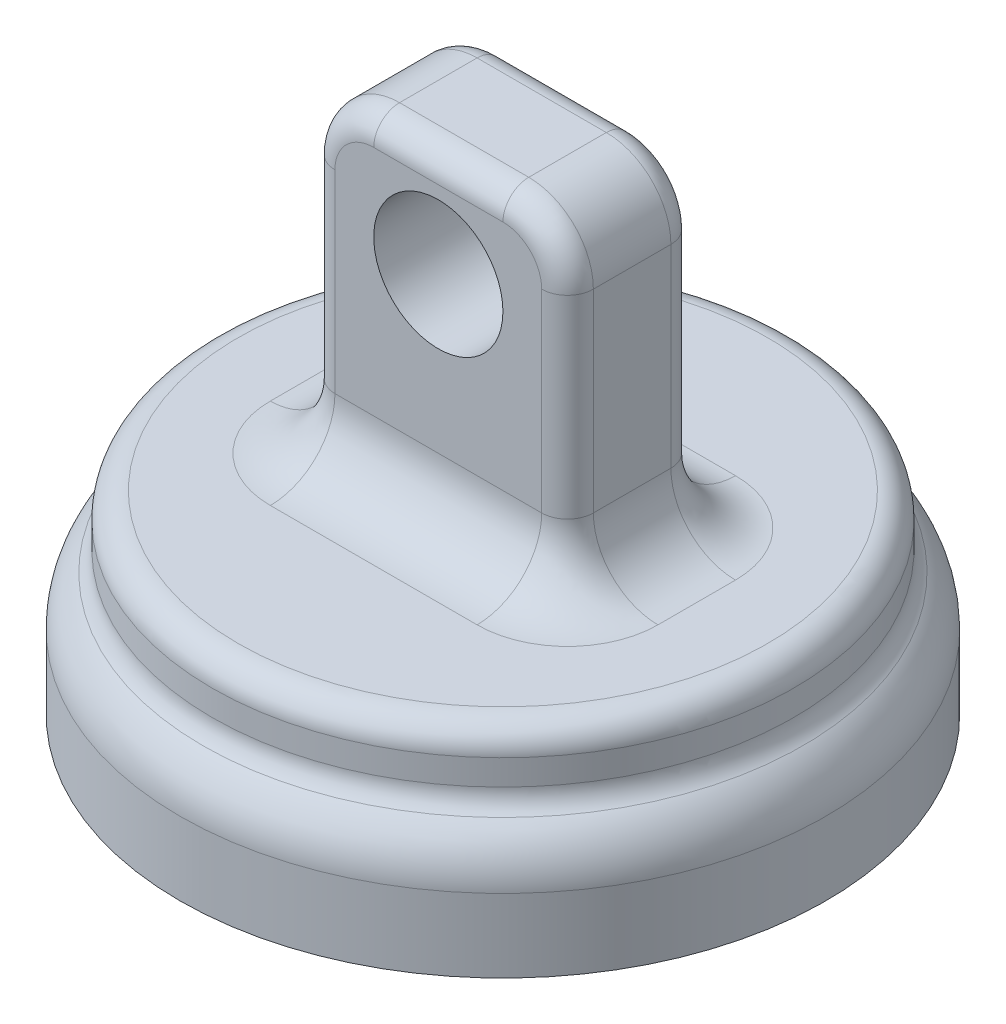
ISO-10303-21;
HEADER;
FILE_DESCRIPTION(('STEP AP214'),'2;1');
FILE_NAME('part.step','',(''),(''),'','','');
FILE_SCHEMA(('AUTOMOTIVE_DESIGN { 1 0 10303 214 1 1 1 1 }'));
ENDSEC;
DATA;
#1=APPLICATION_CONTEXT('core data for automotive mechanical design processes');
#2=APPLICATION_PROTOCOL_DEFINITION('international standard','automotive_design',2000,#1);
#3=PRODUCT_CONTEXT('',#1,'mechanical');
#4=PRODUCT('Part','Part','',(#3));
#5=PRODUCT_RELATED_PRODUCT_CATEGORY('part','',(#4));
#6=PRODUCT_DEFINITION_FORMATION('','',#4);
#7=PRODUCT_DEFINITION_CONTEXT('part definition',#1,'design');
#8=PRODUCT_DEFINITION('design','',#6,#7);
#9=PRODUCT_DEFINITION_SHAPE('','',#8);
#10=(LENGTH_UNIT() NAMED_UNIT(*) SI_UNIT(.MILLI.,.METRE.));
#11=(NAMED_UNIT(*) PLANE_ANGLE_UNIT() SI_UNIT($,.RADIAN.));
#12=(NAMED_UNIT(*) SI_UNIT($,.STERADIAN.) SOLID_ANGLE_UNIT());
#13=UNCERTAINTY_MEASURE_WITH_UNIT(LENGTH_MEASURE(1.E-05),#10,'distance_accuracy_value','');
#14=(GEOMETRIC_REPRESENTATION_CONTEXT(3) GLOBAL_UNCERTAINTY_ASSIGNED_CONTEXT((#13)) GLOBAL_UNIT_ASSIGNED_CONTEXT((#10,
#11,#12)) REPRESENTATION_CONTEXT('',''));
#15=CARTESIAN_POINT('',(0.,0.,0.));
#16=DIRECTION('',(0.,0.,1.));
#17=DIRECTION('',(1.,0.,0.));
#18=AXIS2_PLACEMENT_3D('',#15,#16,#17);
#19=CARTESIAN_POINT('',(0.,10.,0.));
#20=DIRECTION('',(0.,-1.,0.));
#21=DIRECTION('',(0.,0.,-1.));
#22=AXIS2_PLACEMENT_3D('',#19,#20,#21);
#23=CYLINDRICAL_SURFACE('',#22,25.);
#24=CARTESIAN_POINT('',(0.,5.66987298107781,0.));
#25=DIRECTION('',(0.,1.,0.));
#26=DIRECTION('',(0.,0.,1.));
#27=AXIS2_PLACEMENT_3D('',#24,#25,#26);
#28=CIRCLE('',#27,25.);
#29=CARTESIAN_POINT('',(0.,5.66987298107781,25.));
#30=VERTEX_POINT('',#29);
#31=EDGE_CURVE('E367',#30,#30,#28,.F.);
#32=ORIENTED_EDGE('',*,*,#31,.T.);
#33=EDGE_LOOP('',(#32));
#34=FACE_BOUND('',#33,.T.);
#35=CARTESIAN_POINT('',(0.,0.,0.));
#36=DIRECTION('',(0.,1.,0.));
#37=DIRECTION('',(0.,0.,1.));
#38=AXIS2_PLACEMENT_3D('',#35,#36,#37);
#39=CIRCLE('',#38,25.);
#40=CARTESIAN_POINT('',(0.,0.,25.));
#41=VERTEX_POINT('',#40);
#42=EDGE_CURVE('E363',#41,#41,#39,.T.);
#43=ORIENTED_EDGE('',*,*,#42,.T.);
#44=EDGE_LOOP('',(#43));
#45=FACE_BOUND('',#44,.T.);
#46=ADVANCED_FACE('F40',(#34,#45),#23,.T.);
#47=CARTESIAN_POINT('',(0.,0.,0.));
#48=DIRECTION('',(0.,1.,0.));
#49=DIRECTION('',(0.,0.,1.));
#50=AXIS2_PLACEMENT_3D('',#47,#48,#49);
#51=PLANE('',#50);
#52=ORIENTED_EDGE('',*,*,#42,.F.);
#53=EDGE_LOOP('',(#52));
#54=FACE_BOUND('',#53,.T.);
#55=ADVANCED_FACE('F458',(#54),#51,.F.);
#56=CARTESIAN_POINT('',(0.,15.,0.));
#57=DIRECTION('',(0.,-1.,0.));
#58=DIRECTION('',(0.,0.,-1.));
#59=AXIS2_PLACEMENT_3D('',#56,#57,#58);
#60=CYLINDRICAL_SURFACE('',#59,22.5);
#61=CARTESIAN_POINT('',(0.,11.0317756284597,0.));
#62=DIRECTION('',(0.,1.,0.));
#63=DIRECTION('',(0.,0.,1.));
#64=AXIS2_PLACEMENT_3D('',#61,#62,#63);
#65=CIRCLE('',#64,22.5);
#66=CARTESIAN_POINT('',(0.,11.0317756284597,22.5));
#67=VERTEX_POINT('',#66);
#68=EDGE_CURVE('E380',#67,#67,#65,.T.);
#69=ORIENTED_EDGE('',*,*,#68,.T.);
#70=EDGE_LOOP('',(#69));
#71=FACE_BOUND('',#70,.T.);
#72=CARTESIAN_POINT('',(0.,13.,0.));
#73=DIRECTION('',(0.,1.,0.));
#74=DIRECTION('',(0.,0.,1.));
#75=AXIS2_PLACEMENT_3D('',#72,#73,#74);
#76=CIRCLE('',#75,22.5);
#77=CARTESIAN_POINT('',(0.,13.,22.5));
#78=VERTEX_POINT('',#77);
#79=EDGE_CURVE('E376',#78,#78,#76,.F.);
#80=ORIENTED_EDGE('',*,*,#79,.T.);
#81=EDGE_LOOP('',(#80));
#82=FACE_BOUND('',#81,.T.);
#83=ADVANCED_FACE('F464',(#71,#82),#60,.T.);
#84=CARTESIAN_POINT('',(0.,15.,0.));
#85=DIRECTION('',(0.,1.,0.));
#86=DIRECTION('',(0.,0.,1.));
#87=AXIS2_PLACEMENT_3D('',#84,#85,#86);
#88=PLANE('',#87);
#89=DIRECTION('',(1.,0.,0.));
#90=VECTOR('',#89,1.);
#91=CARTESIAN_POINT('',(0.,15.,10.));
#92=LINE('',#91,#90);
#93=CARTESIAN_POINT('',(8.,15.,10.));
#94=VERTEX_POINT('',#93);
#95=CARTESIAN_POINT('',(-8.,15.,10.));
#96=VERTEX_POINT('',#95);
#97=EDGE_CURVE('E231',#94,#96,#92,.F.);
#98=ORIENTED_EDGE('',*,*,#97,.T.);
#99=CARTESIAN_POINT('',(-8.,15.,3.));
#100=DIRECTION('',(0.,1.,0.));
#101=DIRECTION('',(0.,0.,1.));
#102=AXIS2_PLACEMENT_3D('',#99,#100,#101);
#103=CIRCLE('',#102,7.);
#104=CARTESIAN_POINT('',(-15.,15.,3.));
#105=VERTEX_POINT('',#104);
#106=EDGE_CURVE('E267',#96,#105,#103,.F.);
#107=ORIENTED_EDGE('',*,*,#106,.T.);
#108=DIRECTION('',(0.,0.,1.));
#109=VECTOR('',#108,1.);
#110=CARTESIAN_POINT('',(-15.,15.,-3.));
#111=LINE('',#110,#109);
#112=CARTESIAN_POINT('',(-15.,15.,-3.));
#113=VERTEX_POINT('',#112);
#114=EDGE_CURVE('E264',#105,#113,#111,.F.);
#115=ORIENTED_EDGE('',*,*,#114,.T.);
#116=CARTESIAN_POINT('',(-8.,15.,-3.));
#117=DIRECTION('',(0.,1.,0.));
#118=DIRECTION('',(0.,0.,1.));
#119=AXIS2_PLACEMENT_3D('',#116,#117,#118);
#120=CIRCLE('',#119,7.);
#121=CARTESIAN_POINT('',(-8.,15.,-10.));
#122=VERTEX_POINT('',#121);
#123=EDGE_CURVE('E261',#113,#122,#120,.F.);
#124=ORIENTED_EDGE('',*,*,#123,.T.);
#125=DIRECTION('',(1.,0.,0.));
#126=VECTOR('',#125,1.);
#127=CARTESIAN_POINT('',(8.,15.,-10.));
#128=LINE('',#127,#126);
#129=CARTESIAN_POINT('',(8.,15.,-10.));
#130=VERTEX_POINT('',#129);
#131=EDGE_CURVE('E258',#122,#130,#128,.T.);
#132=ORIENTED_EDGE('',*,*,#131,.T.);
#133=CARTESIAN_POINT('',(8.,15.,-3.));
#134=DIRECTION('',(0.,1.,0.));
#135=DIRECTION('',(0.,0.,1.));
#136=AXIS2_PLACEMENT_3D('',#133,#134,#135);
#137=CIRCLE('',#136,7.);
#138=CARTESIAN_POINT('',(15.,15.,-3.));
#139=VERTEX_POINT('',#138);
#140=EDGE_CURVE('E255',#130,#139,#137,.F.);
#141=ORIENTED_EDGE('',*,*,#140,.T.);
#142=DIRECTION('',(0.,0.,1.));
#143=VECTOR('',#142,1.);
#144=CARTESIAN_POINT('',(15.,15.,3.));
#145=LINE('',#144,#143);
#146=CARTESIAN_POINT('',(15.,15.,3.));
#147=VERTEX_POINT('',#146);
#148=EDGE_CURVE('E252',#139,#147,#145,.T.);
#149=ORIENTED_EDGE('',*,*,#148,.T.);
#150=CARTESIAN_POINT('',(8.,15.,3.));
#151=DIRECTION('',(0.,1.,0.));
#152=DIRECTION('',(0.,0.,1.));
#153=AXIS2_PLACEMENT_3D('',#150,#151,#152);
#154=CIRCLE('',#153,7.);
#155=EDGE_CURVE('E249',#147,#94,#154,.F.);
#156=ORIENTED_EDGE('',*,*,#155,.T.);
#157=EDGE_LOOP('',(#98,#107,#115,#124,#132,#141,#149,#156));
#158=FACE_BOUND('',#157,.T.);
#159=CARTESIAN_POINT('',(0.,15.,0.));
#160=DIRECTION('',(0.,1.,0.));
#161=DIRECTION('',(0.,0.,1.));
#162=AXIS2_PLACEMENT_3D('',#159,#160,#161);
#163=CIRCLE('',#162,20.5);
#164=CARTESIAN_POINT('',(0.,15.,20.5));
#165=VERTEX_POINT('',#164);
#166=EDGE_CURVE('E372',#165,#165,#163,.T.);
#167=ORIENTED_EDGE('',*,*,#166,.T.);
#168=EDGE_LOOP('',(#167));
#169=FACE_BOUND('',#168,.T.);
#170=ADVANCED_FACE('F437',(#158,#169),#88,.T.);
#171=CARTESIAN_POINT('',(0.,5.66987298107781,0.));
#172=DIRECTION('',(0.,1.,0.));
#173=DIRECTION('',(0.,0.,1.));
#174=AXIS2_PLACEMENT_3D('',#171,#172,#173);
#175=TOROIDAL_SURFACE('',#174,20.,5.);
#176=CARTESIAN_POINT('',(0.,9.49980344349341,0.));
#177=DIRECTION('',(0.,-1.,0.));
#178=DIRECTION('',(0.,0.,-1.));
#179=AXIS2_PLACEMENT_3D('',#176,#177,#178);
#180=CIRCLE('',#179,23.2142857142857);
#181=CARTESIAN_POINT('',(0.,9.49980344349341,-23.2142857142857));
#182=VERTEX_POINT('',#181);
#183=EDGE_CURVE('E178',#182,#182,#180,.T.);
#184=ORIENTED_EDGE('',*,*,#183,.T.);
#185=EDGE_LOOP('',(#184));
#186=FACE_BOUND('',#185,.T.);
#187=ORIENTED_EDGE('',*,*,#31,.F.);
#188=EDGE_LOOP('',(#187));
#189=FACE_BOUND('',#188,.T.);
#190=ADVANCED_FACE('F470',(#186,#189),#175,.T.);
#191=CARTESIAN_POINT('',(0.,13.,0.));
#192=DIRECTION('',(0.,1.,0.));
#193=DIRECTION('',(0.,0.,1.));
#194=AXIS2_PLACEMENT_3D('',#191,#192,#193);
#195=TOROIDAL_SURFACE('',#194,20.5,2.);
#196=ORIENTED_EDGE('',*,*,#79,.F.);
#197=EDGE_LOOP('',(#196));
#198=FACE_BOUND('',#197,.T.);
#199=ORIENTED_EDGE('',*,*,#166,.F.);
#200=EDGE_LOOP('',(#199));
#201=FACE_BOUND('',#200,.T.);
#202=ADVANCED_FACE('F473',(#198,#201),#195,.T.);
#203=CARTESIAN_POINT('',(0.,11.0317756284597,0.));
#204=DIRECTION('',(0.,1.,0.));
#205=DIRECTION('',(0.,0.,1.));
#206=AXIS2_PLACEMENT_3D('',#203,#204,#205);
#207=TOROIDAL_SURFACE('',#206,24.5,2.);
#208=ORIENTED_EDGE('',*,*,#183,.F.);
#209=EDGE_LOOP('',(#208));
#210=FACE_BOUND('',#209,.T.);
#211=ORIENTED_EDGE('',*,*,#68,.F.);
#212=EDGE_LOOP('',(#211));
#213=FACE_BOUND('',#212,.T.);
#214=ADVANCED_FACE('F477',(#210,#213),#207,.F.);
#215=CARTESIAN_POINT('',(-10.,15.,-5.));
#216=DIRECTION('',(-1.,0.,0.));
#217=DIRECTION('',(0.,0.,1.));
#218=AXIS2_PLACEMENT_3D('',#215,#216,#217);
#219=PLANE('',#218);
#220=DIRECTION('',(0.,-1.,0.));
#221=VECTOR('',#220,1.);
#222=CARTESIAN_POINT('',(-10.,15.,-3.));
#223=LINE('',#222,#221);
#224=CARTESIAN_POINT('',(-10.,35.,-3.));
#225=VERTEX_POINT('',#224);
#226=CARTESIAN_POINT('',(-10.,20.,-3.));
#227=VERTEX_POINT('',#226);
#228=EDGE_CURVE('E221',#225,#227,#223,.T.);
#229=ORIENTED_EDGE('',*,*,#228,.T.);
#230=DIRECTION('',(0.,0.,1.));
#231=VECTOR('',#230,1.);
#232=CARTESIAN_POINT('',(-10.,20.,3.));
#233=LINE('',#232,#231);
#234=CARTESIAN_POINT('',(-10.,20.,3.));
#235=VERTEX_POINT('',#234);
#236=EDGE_CURVE('E275',#227,#235,#233,.T.);
#237=ORIENTED_EDGE('',*,*,#236,.T.);
#238=DIRECTION('',(0.,-1.,0.));
#239=VECTOR('',#238,1.);
#240=CARTESIAN_POINT('',(-10.,35.,3.));
#241=LINE('',#240,#239);
#242=CARTESIAN_POINT('',(-10.,35.,3.));
#243=VERTEX_POINT('',#242);
#244=EDGE_CURVE('E398',#235,#243,#241,.F.);
#245=ORIENTED_EDGE('',*,*,#244,.T.);
#246=DIRECTION('',(0.,0.,1.));
#247=VECTOR('',#246,1.);
#248=CARTESIAN_POINT('',(-10.,35.,-5.));
#249=LINE('',#248,#247);
#250=EDGE_CURVE('E368',#225,#243,#249,.T.);
#251=ORIENTED_EDGE('',*,*,#250,.F.);
#252=EDGE_LOOP('',(#229,#237,#245,#251));
#253=FACE_BOUND('',#252,.T.);
#254=ADVANCED_FACE('F481',(#253),#219,.T.);
#255=CARTESIAN_POINT('',(-5.,35.,-5.));
#256=DIRECTION('',(0.,0.,1.));
#257=DIRECTION('',(1.,0.,0.));
#258=AXIS2_PLACEMENT_3D('',#255,#256,#257);
#259=CYLINDRICAL_SURFACE('',#258,5.);
#260=DIRECTION('',(0.,0.,1.));
#261=VECTOR('',#260,1.);
#262=CARTESIAN_POINT('',(-4.99999999999996,40.,-5.));
#263=LINE('',#262,#261);
#264=CARTESIAN_POINT('',(-4.99999999999996,40.,-3.));
#265=VERTEX_POINT('',#264);
#266=CARTESIAN_POINT('',(-4.99999999999996,40.,3.));
#267=VERTEX_POINT('',#266);
#268=EDGE_CURVE('E357',#265,#267,#263,.T.);
#269=ORIENTED_EDGE('',*,*,#268,.F.);
#270=CARTESIAN_POINT('',(-5.,35.,-3.));
#271=DIRECTION('',(0.,0.,-1.));
#272=DIRECTION('',(-1.,0.,0.));
#273=AXIS2_PLACEMENT_3D('',#270,#271,#272);
#274=CIRCLE('',#273,5.);
#275=EDGE_CURVE('E225',#265,#225,#274,.F.);
#276=ORIENTED_EDGE('',*,*,#275,.T.);
#277=ORIENTED_EDGE('',*,*,#250,.T.);
#278=CARTESIAN_POINT('',(-5.,35.,3.));
#279=DIRECTION('',(0.,0.,-1.));
#280=DIRECTION('',(-1.,0.,0.));
#281=AXIS2_PLACEMENT_3D('',#278,#279,#280);
#282=CIRCLE('',#281,5.);
#283=EDGE_CURVE('E401',#243,#267,#282,.T.);
#284=ORIENTED_EDGE('',*,*,#283,.T.);
#285=EDGE_LOOP('',(#269,#276,#277,#284));
#286=FACE_BOUND('',#285,.T.);
#287=ADVANCED_FACE('F415',(#286),#259,.T.);
#288=CARTESIAN_POINT('',(-4.99999999999996,40.,-5.));
#289=DIRECTION('',(0.,1.,0.));
#290=DIRECTION('',(0.,0.,1.));
#291=AXIS2_PLACEMENT_3D('',#288,#289,#290);
#292=PLANE('',#291);
#293=DIRECTION('',(0.,0.,1.));
#294=VECTOR('',#293,1.);
#295=CARTESIAN_POINT('',(4.99999999999996,40.,-5.));
#296=LINE('',#295,#294);
#297=CARTESIAN_POINT('',(4.99999999999996,40.,-3.));
#298=VERTEX_POINT('',#297);
#299=CARTESIAN_POINT('',(4.99999999999996,40.,3.));
#300=VERTEX_POINT('',#299);
#301=EDGE_CURVE('E352',#298,#300,#296,.T.);
#302=ORIENTED_EDGE('',*,*,#301,.F.);
#303=DIRECTION('',(-1.,0.,0.));
#304=VECTOR('',#303,1.);
#305=CARTESIAN_POINT('',(-4.99999999999996,40.,-3.));
#306=LINE('',#305,#304);
#307=EDGE_CURVE('E228',#298,#265,#306,.T.);
#308=ORIENTED_EDGE('',*,*,#307,.T.);
#309=ORIENTED_EDGE('',*,*,#268,.T.);
#310=DIRECTION('',(-1.,0.,0.));
#311=VECTOR('',#310,1.);
#312=CARTESIAN_POINT('',(4.99999999999996,40.,3.));
#313=LINE('',#312,#311);
#314=EDGE_CURVE('E202',#267,#300,#313,.F.);
#315=ORIENTED_EDGE('',*,*,#314,.T.);
#316=EDGE_LOOP('',(#302,#308,#309,#315));
#317=FACE_BOUND('',#316,.T.);
#318=ADVANCED_FACE('F407',(#317),#292,.T.);
#319=CARTESIAN_POINT('',(5.,35.,-5.));
#320=DIRECTION('',(0.,0.,1.));
#321=DIRECTION('',(1.,0.,0.));
#322=AXIS2_PLACEMENT_3D('',#319,#320,#321);
#323=CYLINDRICAL_SURFACE('',#322,5.);
#324=DIRECTION('',(0.,0.,1.));
#325=VECTOR('',#324,1.);
#326=CARTESIAN_POINT('',(10.,35.,-5.));
#327=LINE('',#326,#325);
#328=CARTESIAN_POINT('',(10.,35.,-3.));
#329=VERTEX_POINT('',#328);
#330=CARTESIAN_POINT('',(10.,35.,3.));
#331=VERTEX_POINT('',#330);
#332=EDGE_CURVE('E348',#329,#331,#327,.T.);
#333=ORIENTED_EDGE('',*,*,#332,.F.);
#334=CARTESIAN_POINT('',(5.,35.,-3.));
#335=DIRECTION('',(0.,0.,-1.));
#336=DIRECTION('',(-1.,0.,0.));
#337=AXIS2_PLACEMENT_3D('',#334,#335,#336);
#338=CIRCLE('',#337,5.);
#339=EDGE_CURVE('E218',#329,#298,#338,.F.);
#340=ORIENTED_EDGE('',*,*,#339,.T.);
#341=ORIENTED_EDGE('',*,*,#301,.T.);
#342=CARTESIAN_POINT('',(5.,35.,3.));
#343=DIRECTION('',(0.,0.,-1.));
#344=DIRECTION('',(-1.,0.,0.));
#345=AXIS2_PLACEMENT_3D('',#342,#343,#344);
#346=CIRCLE('',#345,5.);
#347=EDGE_CURVE('E182',#300,#331,#346,.T.);
#348=ORIENTED_EDGE('',*,*,#347,.T.);
#349=EDGE_LOOP('',(#333,#340,#341,#348));
#350=FACE_BOUND('',#349,.T.);
#351=ADVANCED_FACE('F349',(#350),#323,.T.);
#352=CARTESIAN_POINT('',(10.,15.,-5.));
#353=DIRECTION('',(1.,0.,0.));
#354=DIRECTION('',(0.,0.,-1.));
#355=AXIS2_PLACEMENT_3D('',#352,#353,#354);
#356=PLANE('',#355);
#357=DIRECTION('',(0.,1.,0.));
#358=VECTOR('',#357,1.);
#359=CARTESIAN_POINT('',(10.,15.,3.));
#360=LINE('',#359,#358);
#361=CARTESIAN_POINT('',(10.,20.,3.));
#362=VERTEX_POINT('',#361);
#363=EDGE_CURVE('E393',#331,#362,#360,.F.);
#364=ORIENTED_EDGE('',*,*,#363,.T.);
#365=DIRECTION('',(0.,0.,1.));
#366=VECTOR('',#365,1.);
#367=CARTESIAN_POINT('',(10.,20.,-3.));
#368=LINE('',#367,#366);
#369=CARTESIAN_POINT('',(10.,20.,-3.));
#370=VERTEX_POINT('',#369);
#371=EDGE_CURVE('E287',#362,#370,#368,.F.);
#372=ORIENTED_EDGE('',*,*,#371,.T.);
#373=DIRECTION('',(0.,1.,0.));
#374=VECTOR('',#373,1.);
#375=CARTESIAN_POINT('',(10.,15.,-3.));
#376=LINE('',#375,#374);
#377=EDGE_CURVE('E198',#370,#329,#376,.T.);
#378=ORIENTED_EDGE('',*,*,#377,.T.);
#379=ORIENTED_EDGE('',*,*,#332,.T.);
#380=EDGE_LOOP('',(#364,#372,#378,#379));
#381=FACE_BOUND('',#380,.T.);
#382=ADVANCED_FACE('F644',(#381),#356,.T.);
#383=CARTESIAN_POINT('',(-5.,35.,-5.));
#384=DIRECTION('',(0.,0.,-1.));
#385=DIRECTION('',(-1.,0.,0.));
#386=AXIS2_PLACEMENT_3D('',#383,#384,#385);
#387=PLANE('',#386);
#388=CARTESIAN_POINT('',(0.,32.,-5.));
#389=DIRECTION('',(0.,0.,1.));
#390=DIRECTION('',(1.,0.,0.));
#391=AXIS2_PLACEMENT_3D('',#388,#389,#390);
#392=CIRCLE('',#391,5.);
#393=CARTESIAN_POINT('',(5.,32.,-5.));
#394=VERTEX_POINT('',#393);
#395=EDGE_CURVE('E353',#394,#394,#392,.T.);
#396=ORIENTED_EDGE('',*,*,#395,.T.);
#397=EDGE_LOOP('',(#396));
#398=FACE_BOUND('',#397,.T.);
#399=DIRECTION('',(0.,1.,0.));
#400=VECTOR('',#399,1.);
#401=CARTESIAN_POINT('',(8.,35.,-5.));
#402=LINE('',#401,#400);
#403=CARTESIAN_POINT('',(8.,35.,-5.));
#404=VERTEX_POINT('',#403);
#405=CARTESIAN_POINT('',(8.,20.,-5.));
#406=VERTEX_POINT('',#405);
#407=EDGE_CURVE('E214',#404,#406,#402,.F.);
#408=ORIENTED_EDGE('',*,*,#407,.T.);
#409=DIRECTION('',(1.,0.,0.));
#410=VECTOR('',#409,1.);
#411=CARTESIAN_POINT('',(-8.,20.,-5.));
#412=LINE('',#411,#410);
#413=CARTESIAN_POINT('',(-8.,20.,-5.));
#414=VERTEX_POINT('',#413);
#415=EDGE_CURVE('E281',#406,#414,#412,.F.);
#416=ORIENTED_EDGE('',*,*,#415,.T.);
#417=DIRECTION('',(0.,-1.,0.));
#418=VECTOR('',#417,1.);
#419=CARTESIAN_POINT('',(-8.,35.,-5.));
#420=LINE('',#419,#418);
#421=CARTESIAN_POINT('',(-8.,35.,-5.));
#422=VERTEX_POINT('',#421);
#423=EDGE_CURVE('E208',#414,#422,#420,.F.);
#424=ORIENTED_EDGE('',*,*,#423,.T.);
#425=CARTESIAN_POINT('',(-5.,35.,-5.));
#426=DIRECTION('',(0.,0.,-1.));
#427=DIRECTION('',(-1.,0.,0.));
#428=AXIS2_PLACEMENT_3D('',#425,#426,#427);
#429=CIRCLE('',#428,3.);
#430=CARTESIAN_POINT('',(-4.99999999999998,38.,-5.));
#431=VERTEX_POINT('',#430);
#432=EDGE_CURVE('E205',#422,#431,#429,.T.);
#433=ORIENTED_EDGE('',*,*,#432,.T.);
#434=DIRECTION('',(-1.,0.,0.));
#435=VECTOR('',#434,1.);
#436=CARTESIAN_POINT('',(-5.,38.,-5.));
#437=LINE('',#436,#435);
#438=CARTESIAN_POINT('',(4.99999999999998,38.,-5.));
#439=VERTEX_POINT('',#438);
#440=EDGE_CURVE('E201',#431,#439,#437,.F.);
#441=ORIENTED_EDGE('',*,*,#440,.T.);
#442=CARTESIAN_POINT('',(5.,35.,-5.));
#443=DIRECTION('',(0.,0.,-1.));
#444=DIRECTION('',(-1.,0.,0.));
#445=AXIS2_PLACEMENT_3D('',#442,#443,#444);
#446=CIRCLE('',#445,3.);
#447=EDGE_CURVE('E211',#439,#404,#446,.T.);
#448=ORIENTED_EDGE('',*,*,#447,.T.);
#449=EDGE_LOOP('',(#408,#416,#424,#433,#441,#448));
#450=FACE_BOUND('',#449,.T.);
#451=ADVANCED_FACE('F337',(#398,#450),#387,.T.);
#452=CARTESIAN_POINT('',(-5.,35.,5.));
#453=DIRECTION('',(0.,0.,-1.));
#454=DIRECTION('',(-1.,0.,0.));
#455=AXIS2_PLACEMENT_3D('',#452,#453,#454);
#456=PLANE('',#455);
#457=DIRECTION('',(0.,-1.,0.));
#458=VECTOR('',#457,1.);
#459=CARTESIAN_POINT('',(-8.,15.,5.));
#460=LINE('',#459,#458);
#461=CARTESIAN_POINT('',(-8.,35.,5.));
#462=VERTEX_POINT('',#461);
#463=CARTESIAN_POINT('',(-8.,20.,5.));
#464=VERTEX_POINT('',#463);
#465=EDGE_CURVE('E165',#462,#464,#460,.T.);
#466=ORIENTED_EDGE('',*,*,#465,.T.);
#467=DIRECTION('',(1.,0.,0.));
#468=VECTOR('',#467,1.);
#469=CARTESIAN_POINT('',(-5.,20.,5.));
#470=LINE('',#469,#468);
#471=CARTESIAN_POINT('',(8.,20.,5.));
#472=VERTEX_POINT('',#471);
#473=EDGE_CURVE('E11',#464,#472,#470,.T.);
#474=ORIENTED_EDGE('',*,*,#473,.T.);
#475=DIRECTION('',(0.,1.,0.));
#476=VECTOR('',#475,1.);
#477=CARTESIAN_POINT('',(8.,35.,5.));
#478=LINE('',#477,#476);
#479=CARTESIAN_POINT('',(8.,35.,5.));
#480=VERTEX_POINT('',#479);
#481=EDGE_CURVE('E159',#472,#480,#478,.T.);
#482=ORIENTED_EDGE('',*,*,#481,.T.);
#483=CARTESIAN_POINT('',(5.,35.,5.));
#484=DIRECTION('',(0.,0.,-1.));
#485=DIRECTION('',(-1.,0.,0.));
#486=AXIS2_PLACEMENT_3D('',#483,#484,#485);
#487=CIRCLE('',#486,3.);
#488=CARTESIAN_POINT('',(4.99999999999998,38.,5.));
#489=VERTEX_POINT('',#488);
#490=EDGE_CURVE('E153',#480,#489,#487,.F.);
#491=ORIENTED_EDGE('',*,*,#490,.T.);
#492=DIRECTION('',(-1.,0.,0.));
#493=VECTOR('',#492,1.);
#494=CARTESIAN_POINT('',(-4.99999999999996,38.,5.));
#495=LINE('',#494,#493);
#496=CARTESIAN_POINT('',(-4.99999999999998,38.,5.));
#497=VERTEX_POINT('',#496);
#498=EDGE_CURVE('E157',#489,#497,#495,.T.);
#499=ORIENTED_EDGE('',*,*,#498,.T.);
#500=CARTESIAN_POINT('',(-5.,35.,5.));
#501=DIRECTION('',(0.,0.,-1.));
#502=DIRECTION('',(-1.,0.,0.));
#503=AXIS2_PLACEMENT_3D('',#500,#501,#502);
#504=CIRCLE('',#503,3.);
#505=EDGE_CURVE('E177',#497,#462,#504,.F.);
#506=ORIENTED_EDGE('',*,*,#505,.T.);
#507=EDGE_LOOP('',(#466,#474,#482,#491,#499,#506));
#508=FACE_BOUND('',#507,.T.);
#509=CARTESIAN_POINT('',(0.,32.,5.));
#510=DIRECTION('',(0.,0.,1.));
#511=DIRECTION('',(1.,0.,0.));
#512=AXIS2_PLACEMENT_3D('',#509,#510,#511);
#513=CIRCLE('',#512,5.);
#514=CARTESIAN_POINT('',(5.,32.,5.));
#515=VERTEX_POINT('',#514);
#516=EDGE_CURVE('E197',#515,#515,#513,.T.);
#517=ORIENTED_EDGE('',*,*,#516,.F.);
#518=EDGE_LOOP('',(#517));
#519=FACE_BOUND('',#518,.T.);
#520=ADVANCED_FACE('F155',(#508,#519),#456,.F.);
#521=CARTESIAN_POINT('',(0.,32.,-5.));
#522=DIRECTION('',(0.,0.,1.));
#523=DIRECTION('',(1.,0.,0.));
#524=AXIS2_PLACEMENT_3D('',#521,#522,#523);
#525=CYLINDRICAL_SURFACE('',#524,5.);
#526=ORIENTED_EDGE('',*,*,#395,.F.);
#527=EDGE_LOOP('',(#526));
#528=FACE_BOUND('',#527,.T.);
#529=ORIENTED_EDGE('',*,*,#516,.T.);
#530=EDGE_LOOP('',(#529));
#531=FACE_BOUND('',#530,.T.);
#532=ADVANCED_FACE('F495',(#528,#531),#525,.F.);
#533=CARTESIAN_POINT('',(-8.,35.,3.));
#534=DIRECTION('',(0.,1.,0.));
#535=DIRECTION('',(0.,0.,1.));
#536=AXIS2_PLACEMENT_3D('',#533,#534,#535);
#537=CYLINDRICAL_SURFACE('',#536,2.);
#538=ORIENTED_EDGE('',*,*,#244,.F.);
#539=CARTESIAN_POINT('',(-8.,20.,3.));
#540=DIRECTION('',(0.,1.,0.));
#541=DIRECTION('',(0.,0.,1.));
#542=AXIS2_PLACEMENT_3D('',#539,#540,#541);
#543=CIRCLE('',#542,2.);
#544=EDGE_CURVE('E271',#235,#464,#543,.T.);
#545=ORIENTED_EDGE('',*,*,#544,.T.);
#546=ORIENTED_EDGE('',*,*,#465,.F.);
#547=CARTESIAN_POINT('',(-8.,35.,3.));
#548=DIRECTION('',(0.,1.,0.));
#549=DIRECTION('',(0.,0.,1.));
#550=AXIS2_PLACEMENT_3D('',#547,#548,#549);
#551=CIRCLE('',#550,2.);
#552=EDGE_CURVE('E188',#243,#462,#551,.T.);
#553=ORIENTED_EDGE('',*,*,#552,.F.);
#554=EDGE_LOOP('',(#538,#545,#546,#553));
#555=FACE_BOUND('',#554,.T.);
#556=ADVANCED_FACE('F423',(#555),#537,.T.);
#557=CARTESIAN_POINT('',(-5.,35.,3.));
#558=DIRECTION('',(0.,0.,-1.));
#559=DIRECTION('',(-1.,0.,0.));
#560=AXIS2_PLACEMENT_3D('',#557,#558,#559);
#561=TOROIDAL_SURFACE('',#560,3.,2.);
#562=ORIENTED_EDGE('',*,*,#552,.T.);
#563=ORIENTED_EDGE('',*,*,#505,.F.);
#564=CARTESIAN_POINT('',(-4.99999999999998,38.,3.));
#565=DIRECTION('',(1.,0.,0.));
#566=DIRECTION('',(0.,1.,0.));
#567=AXIS2_PLACEMENT_3D('',#564,#565,#566);
#568=CIRCLE('',#567,2.);
#569=EDGE_CURVE('E175',#267,#497,#568,.T.);
#570=ORIENTED_EDGE('',*,*,#569,.F.);
#571=ORIENTED_EDGE('',*,*,#283,.F.);
#572=EDGE_LOOP('',(#562,#563,#570,#571));
#573=FACE_BOUND('',#572,.T.);
#574=ADVANCED_FACE('F419',(#573),#561,.T.);
#575=CARTESIAN_POINT('',(-5.,38.,3.));
#576=DIRECTION('',(1.,0.,0.));
#577=DIRECTION('',(0.,0.,-1.));
#578=AXIS2_PLACEMENT_3D('',#575,#576,#577);
#579=CYLINDRICAL_SURFACE('',#578,2.);
#580=ORIENTED_EDGE('',*,*,#569,.T.);
#581=ORIENTED_EDGE('',*,*,#498,.F.);
#582=CARTESIAN_POINT('',(4.99999999999996,38.,3.));
#583=DIRECTION('',(1.,0.,0.));
#584=DIRECTION('',(0.,0.,-1.));
#585=AXIS2_PLACEMENT_3D('',#582,#583,#584);
#586=CIRCLE('',#585,2.);
#587=EDGE_CURVE('E172',#300,#489,#586,.T.);
#588=ORIENTED_EDGE('',*,*,#587,.F.);
#589=ORIENTED_EDGE('',*,*,#314,.F.);
#590=EDGE_LOOP('',(#580,#581,#588,#589));
#591=FACE_BOUND('',#590,.T.);
#592=ADVANCED_FACE('F170',(#591),#579,.T.);
#593=CARTESIAN_POINT('',(5.,35.,3.));
#594=DIRECTION('',(0.,0.,-1.));
#595=DIRECTION('',(-1.,0.,0.));
#596=AXIS2_PLACEMENT_3D('',#593,#594,#595);
#597=TOROIDAL_SURFACE('',#596,3.,2.);
#598=ORIENTED_EDGE('',*,*,#587,.T.);
#599=ORIENTED_EDGE('',*,*,#490,.F.);
#600=CARTESIAN_POINT('',(8.,35.,3.));
#601=DIRECTION('',(0.,-1.,0.));
#602=DIRECTION('',(0.,0.,-1.));
#603=AXIS2_PLACEMENT_3D('',#600,#601,#602);
#604=CIRCLE('',#603,2.);
#605=EDGE_CURVE('E184',#331,#480,#604,.T.);
#606=ORIENTED_EDGE('',*,*,#605,.F.);
#607=ORIENTED_EDGE('',*,*,#347,.F.);
#608=EDGE_LOOP('',(#598,#599,#606,#607));
#609=FACE_BOUND('',#608,.T.);
#610=ADVANCED_FACE('F180',(#609),#597,.T.);
#611=CARTESIAN_POINT('',(8.,35.,3.));
#612=DIRECTION('',(0.,-1.,0.));
#613=DIRECTION('',(0.,0.,-1.));
#614=AXIS2_PLACEMENT_3D('',#611,#612,#613);
#615=CYLINDRICAL_SURFACE('',#614,2.);
#616=ORIENTED_EDGE('',*,*,#481,.F.);
#617=CARTESIAN_POINT('',(8.,20.,3.));
#618=DIRECTION('',(0.,1.,0.));
#619=DIRECTION('',(0.,0.,1.));
#620=AXIS2_PLACEMENT_3D('',#617,#618,#619);
#621=CIRCLE('',#620,2.);
#622=EDGE_CURVE('E50',#472,#362,#621,.T.);
#623=ORIENTED_EDGE('',*,*,#622,.T.);
#624=ORIENTED_EDGE('',*,*,#363,.F.);
#625=ORIENTED_EDGE('',*,*,#605,.T.);
#626=EDGE_LOOP('',(#616,#623,#624,#625));
#627=FACE_BOUND('',#626,.T.);
#628=ADVANCED_FACE('F483',(#627),#615,.T.);
#629=CARTESIAN_POINT('',(-8.,15.,-3.));
#630=DIRECTION('',(0.,-1.,0.));
#631=DIRECTION('',(0.,0.,-1.));
#632=AXIS2_PLACEMENT_3D('',#629,#630,#631);
#633=CYLINDRICAL_SURFACE('',#632,2.);
#634=ORIENTED_EDGE('',*,*,#423,.F.);
#635=CARTESIAN_POINT('',(-8.,20.,-3.));
#636=DIRECTION('',(0.,1.,0.));
#637=DIRECTION('',(0.,0.,1.));
#638=AXIS2_PLACEMENT_3D('',#635,#636,#637);
#639=CIRCLE('',#638,2.);
#640=EDGE_CURVE('E278',#414,#227,#639,.T.);
#641=ORIENTED_EDGE('',*,*,#640,.T.);
#642=ORIENTED_EDGE('',*,*,#228,.F.);
#643=CARTESIAN_POINT('',(-8.,35.,-3.));
#644=DIRECTION('',(0.,1.,0.));
#645=DIRECTION('',(0.,0.,1.));
#646=AXIS2_PLACEMENT_3D('',#643,#644,#645);
#647=CIRCLE('',#646,2.);
#648=EDGE_CURVE('E190',#422,#225,#647,.T.);
#649=ORIENTED_EDGE('',*,*,#648,.F.);
#650=EDGE_LOOP('',(#634,#641,#642,#649));
#651=FACE_BOUND('',#650,.T.);
#652=ADVANCED_FACE('F486',(#651),#633,.T.);
#653=CARTESIAN_POINT('',(-5.,35.,-3.));
#654=DIRECTION('',(0.,0.,-1.));
#655=DIRECTION('',(-1.,0.,0.));
#656=AXIS2_PLACEMENT_3D('',#653,#654,#655);
#657=TOROIDAL_SURFACE('',#656,3.,2.);
#658=ORIENTED_EDGE('',*,*,#648,.T.);
#659=ORIENTED_EDGE('',*,*,#275,.F.);
#660=CARTESIAN_POINT('',(-4.99999999999998,38.,-3.));
#661=DIRECTION('',(1.,0.,0.));
#662=DIRECTION('',(0.,1.,0.));
#663=AXIS2_PLACEMENT_3D('',#660,#661,#662);
#664=CIRCLE('',#663,2.);
#665=EDGE_CURVE('E240',#431,#265,#664,.T.);
#666=ORIENTED_EDGE('',*,*,#665,.F.);
#667=ORIENTED_EDGE('',*,*,#432,.F.);
#668=EDGE_LOOP('',(#658,#659,#666,#667));
#669=FACE_BOUND('',#668,.T.);
#670=ADVANCED_FACE('F503',(#669),#657,.T.);
#671=CARTESIAN_POINT('',(-4.99999999999996,38.,-3.));
#672=DIRECTION('',(-1.,0.,0.));
#673=DIRECTION('',(0.,0.,1.));
#674=AXIS2_PLACEMENT_3D('',#671,#672,#673);
#675=CYLINDRICAL_SURFACE('',#674,2.);
#676=ORIENTED_EDGE('',*,*,#665,.T.);
#677=ORIENTED_EDGE('',*,*,#307,.F.);
#678=CARTESIAN_POINT('',(4.99999999999998,38.,-3.));
#679=DIRECTION('',(1.,0.,0.));
#680=DIRECTION('',(0.,1.,0.));
#681=AXIS2_PLACEMENT_3D('',#678,#679,#680);
#682=CIRCLE('',#681,2.);
#683=EDGE_CURVE('E236',#439,#298,#682,.T.);
#684=ORIENTED_EDGE('',*,*,#683,.F.);
#685=ORIENTED_EDGE('',*,*,#440,.F.);
#686=EDGE_LOOP('',(#676,#677,#684,#685));
#687=FACE_BOUND('',#686,.T.);
#688=ADVANCED_FACE('F500',(#687),#675,.T.);
#689=CARTESIAN_POINT('',(5.,35.,-3.));
#690=DIRECTION('',(0.,0.,-1.));
#691=DIRECTION('',(-1.,0.,0.));
#692=AXIS2_PLACEMENT_3D('',#689,#690,#691);
#693=TOROIDAL_SURFACE('',#692,3.,2.);
#694=ORIENTED_EDGE('',*,*,#683,.T.);
#695=ORIENTED_EDGE('',*,*,#339,.F.);
#696=CARTESIAN_POINT('',(8.,35.,-3.));
#697=DIRECTION('',(0.,-1.,0.));
#698=DIRECTION('',(0.,0.,-1.));
#699=AXIS2_PLACEMENT_3D('',#696,#697,#698);
#700=CIRCLE('',#699,2.);
#701=EDGE_CURVE('E232',#404,#329,#700,.T.);
#702=ORIENTED_EDGE('',*,*,#701,.F.);
#703=ORIENTED_EDGE('',*,*,#447,.F.);
#704=EDGE_LOOP('',(#694,#695,#702,#703));
#705=FACE_BOUND('',#704,.T.);
#706=ADVANCED_FACE('F343',(#705),#693,.T.);
#707=CARTESIAN_POINT('',(8.,15.,-3.));
#708=DIRECTION('',(0.,1.,0.));
#709=DIRECTION('',(0.,0.,1.));
#710=AXIS2_PLACEMENT_3D('',#707,#708,#709);
#711=CYLINDRICAL_SURFACE('',#710,2.);
#712=ORIENTED_EDGE('',*,*,#377,.F.);
#713=CARTESIAN_POINT('',(8.,20.,-3.));
#714=DIRECTION('',(0.,1.,0.));
#715=DIRECTION('',(0.,0.,1.));
#716=AXIS2_PLACEMENT_3D('',#713,#714,#715);
#717=CIRCLE('',#716,2.);
#718=EDGE_CURVE('E284',#370,#406,#717,.T.);
#719=ORIENTED_EDGE('',*,*,#718,.T.);
#720=ORIENTED_EDGE('',*,*,#407,.F.);
#721=ORIENTED_EDGE('',*,*,#701,.T.);
#722=EDGE_LOOP('',(#712,#719,#720,#721));
#723=FACE_BOUND('',#722,.T.);
#724=ADVANCED_FACE('F334',(#723),#711,.T.);
#725=CARTESIAN_POINT('',(8.,20.,-3.));
#726=DIRECTION('',(0.,1.,0.));
#727=DIRECTION('',(0.,0.,1.));
#728=AXIS2_PLACEMENT_3D('',#725,#726,#727);
#729=TOROIDAL_SURFACE('',#728,7.,5.);
#730=CARTESIAN_POINT('',(8.,20.,-10.));
#731=DIRECTION('',(1.,0.,0.));
#732=DIRECTION('',(0.,0.,-1.));
#733=AXIS2_PLACEMENT_3D('',#730,#731,#732);
#734=CIRCLE('',#733,5.);
#735=EDGE_CURVE('E313',#406,#130,#734,.T.);
#736=ORIENTED_EDGE('',*,*,#735,.F.);
#737=ORIENTED_EDGE('',*,*,#718,.F.);
#738=CARTESIAN_POINT('',(15.,20.,-3.));
#739=DIRECTION('',(0.,0.,-1.));
#740=DIRECTION('',(-1.,0.,0.));
#741=AXIS2_PLACEMENT_3D('',#738,#739,#740);
#742=CIRCLE('',#741,5.);
#743=EDGE_CURVE('E44',#139,#370,#742,.T.);
#744=ORIENTED_EDGE('',*,*,#743,.F.);
#745=ORIENTED_EDGE('',*,*,#140,.F.);
#746=EDGE_LOOP('',(#736,#737,#744,#745));
#747=FACE_BOUND('',#746,.T.);
#748=ADVANCED_FACE('F42',(#747),#729,.F.);
#749=CARTESIAN_POINT('',(15.,20.,0.));
#750=DIRECTION('',(0.,0.,-1.));
#751=DIRECTION('',(-1.,0.,0.));
#752=AXIS2_PLACEMENT_3D('',#749,#750,#751);
#753=CYLINDRICAL_SURFACE('',#752,5.);
#754=ORIENTED_EDGE('',*,*,#743,.T.);
#755=ORIENTED_EDGE('',*,*,#371,.F.);
#756=CARTESIAN_POINT('',(15.,20.,3.));
#757=DIRECTION('',(0.,0.,-1.));
#758=DIRECTION('',(-1.,0.,0.));
#759=AXIS2_PLACEMENT_3D('',#756,#757,#758);
#760=CIRCLE('',#759,5.);
#761=EDGE_CURVE('E310',#147,#362,#760,.T.);
#762=ORIENTED_EDGE('',*,*,#761,.F.);
#763=ORIENTED_EDGE('',*,*,#148,.F.);
#764=EDGE_LOOP('',(#754,#755,#762,#763));
#765=FACE_BOUND('',#764,.T.);
#766=ADVANCED_FACE('F326',(#765),#753,.F.);
#767=CARTESIAN_POINT('',(0.,20.,-10.));
#768=DIRECTION('',(-1.,0.,0.));
#769=DIRECTION('',(0.,0.,1.));
#770=AXIS2_PLACEMENT_3D('',#767,#768,#769);
#771=CYLINDRICAL_SURFACE('',#770,5.);
#772=ORIENTED_EDGE('',*,*,#735,.T.);
#773=ORIENTED_EDGE('',*,*,#131,.F.);
#774=CARTESIAN_POINT('',(-8.,20.,-10.));
#775=DIRECTION('',(1.,0.,0.));
#776=DIRECTION('',(0.,0.,-1.));
#777=AXIS2_PLACEMENT_3D('',#774,#775,#776);
#778=CIRCLE('',#777,5.);
#779=EDGE_CURVE('E306',#414,#122,#778,.T.);
#780=ORIENTED_EDGE('',*,*,#779,.F.);
#781=ORIENTED_EDGE('',*,*,#415,.F.);
#782=EDGE_LOOP('',(#772,#773,#780,#781));
#783=FACE_BOUND('',#782,.T.);
#784=ADVANCED_FACE('F448',(#783),#771,.F.);
#785=CARTESIAN_POINT('',(8.,20.,3.));
#786=DIRECTION('',(0.,1.,0.));
#787=DIRECTION('',(0.,0.,1.));
#788=AXIS2_PLACEMENT_3D('',#785,#786,#787);
#789=TOROIDAL_SURFACE('',#788,7.,5.);
#790=ORIENTED_EDGE('',*,*,#761,.T.);
#791=ORIENTED_EDGE('',*,*,#622,.F.);
#792=CARTESIAN_POINT('',(8.,20.,10.));
#793=DIRECTION('',(1.,0.,0.));
#794=DIRECTION('',(0.,0.,-1.));
#795=AXIS2_PLACEMENT_3D('',#792,#793,#794);
#796=CIRCLE('',#795,5.);
#797=EDGE_CURVE('E302',#94,#472,#796,.T.);
#798=ORIENTED_EDGE('',*,*,#797,.F.);
#799=ORIENTED_EDGE('',*,*,#155,.F.);
#800=EDGE_LOOP('',(#790,#791,#798,#799));
#801=FACE_BOUND('',#800,.T.);
#802=ADVANCED_FACE('F445',(#801),#789,.F.);
#803=CARTESIAN_POINT('',(-8.,20.,-3.));
#804=DIRECTION('',(0.,1.,0.));
#805=DIRECTION('',(0.,0.,1.));
#806=AXIS2_PLACEMENT_3D('',#803,#804,#805);
#807=TOROIDAL_SURFACE('',#806,7.,5.);
#808=ORIENTED_EDGE('',*,*,#779,.T.);
#809=ORIENTED_EDGE('',*,*,#123,.F.);
#810=CARTESIAN_POINT('',(-15.,20.,-3.));
#811=DIRECTION('',(0.,0.,-1.));
#812=DIRECTION('',(-1.,0.,0.));
#813=AXIS2_PLACEMENT_3D('',#810,#811,#812);
#814=CIRCLE('',#813,5.);
#815=EDGE_CURVE('E298',#227,#113,#814,.T.);
#816=ORIENTED_EDGE('',*,*,#815,.F.);
#817=ORIENTED_EDGE('',*,*,#640,.F.);
#818=EDGE_LOOP('',(#808,#809,#816,#817));
#819=FACE_BOUND('',#818,.T.);
#820=ADVANCED_FACE('F447',(#819),#807,.F.);
#821=CARTESIAN_POINT('',(-5.,20.,10.));
#822=DIRECTION('',(1.,0.,0.));
#823=DIRECTION('',(0.,0.,-1.));
#824=AXIS2_PLACEMENT_3D('',#821,#822,#823);
#825=CYLINDRICAL_SURFACE('',#824,5.);
#826=ORIENTED_EDGE('',*,*,#797,.T.);
#827=ORIENTED_EDGE('',*,*,#473,.F.);
#828=CARTESIAN_POINT('',(-8.,20.,10.));
#829=DIRECTION('',(1.,0.,0.));
#830=DIRECTION('',(0.,0.,-1.));
#831=AXIS2_PLACEMENT_3D('',#828,#829,#830);
#832=CIRCLE('',#831,5.);
#833=EDGE_CURVE('E295',#96,#464,#832,.T.);
#834=ORIENTED_EDGE('',*,*,#833,.F.);
#835=ORIENTED_EDGE('',*,*,#97,.F.);
#836=EDGE_LOOP('',(#826,#827,#834,#835));
#837=FACE_BOUND('',#836,.T.);
#838=ADVANCED_FACE('F443',(#837),#825,.F.);
#839=CARTESIAN_POINT('',(-15.,20.,-5.));
#840=DIRECTION('',(0.,0.,-1.));
#841=DIRECTION('',(-1.,0.,0.));
#842=AXIS2_PLACEMENT_3D('',#839,#840,#841);
#843=CYLINDRICAL_SURFACE('',#842,5.);
#844=ORIENTED_EDGE('',*,*,#815,.T.);
#845=ORIENTED_EDGE('',*,*,#114,.F.);
#846=CARTESIAN_POINT('',(-15.,20.,3.));
#847=DIRECTION('',(0.,0.,-1.));
#848=DIRECTION('',(-1.,0.,0.));
#849=AXIS2_PLACEMENT_3D('',#846,#847,#848);
#850=CIRCLE('',#849,5.);
#851=EDGE_CURVE('E292',#235,#105,#850,.T.);
#852=ORIENTED_EDGE('',*,*,#851,.F.);
#853=ORIENTED_EDGE('',*,*,#236,.F.);
#854=EDGE_LOOP('',(#844,#845,#852,#853));
#855=FACE_BOUND('',#854,.T.);
#856=ADVANCED_FACE('F433',(#855),#843,.F.);
#857=CARTESIAN_POINT('',(-8.,20.,3.));
#858=DIRECTION('',(0.,1.,0.));
#859=DIRECTION('',(0.,0.,1.));
#860=AXIS2_PLACEMENT_3D('',#857,#858,#859);
#861=TOROIDAL_SURFACE('',#860,7.,5.);
#862=ORIENTED_EDGE('',*,*,#833,.T.);
#863=ORIENTED_EDGE('',*,*,#544,.F.);
#864=ORIENTED_EDGE('',*,*,#851,.T.);
#865=ORIENTED_EDGE('',*,*,#106,.F.);
#866=EDGE_LOOP('',(#862,#863,#864,#865));
#867=FACE_BOUND('',#866,.T.);
#868=ADVANCED_FACE('F427',(#867),#861,.F.);
#869=CLOSED_SHELL('',(#46,#55,#83,#170,#190,#202,#214,#254,#287,#318,#351,#382,#451,#520,#532,
#556,#574,#592,#610,#628,#652,#670,#688,#706,#724,#748,#766,#784,#802,#820,#838,#856,#868));
#870=MANIFOLD_SOLID_BREP('B2',#869);
#871=ADVANCED_BREP_SHAPE_REPRESENTATION('',(#18,#870),#14);
#872=SHAPE_DEFINITION_REPRESENTATION(#9,#871);
ENDSEC;
END-ISO-10303-21;
